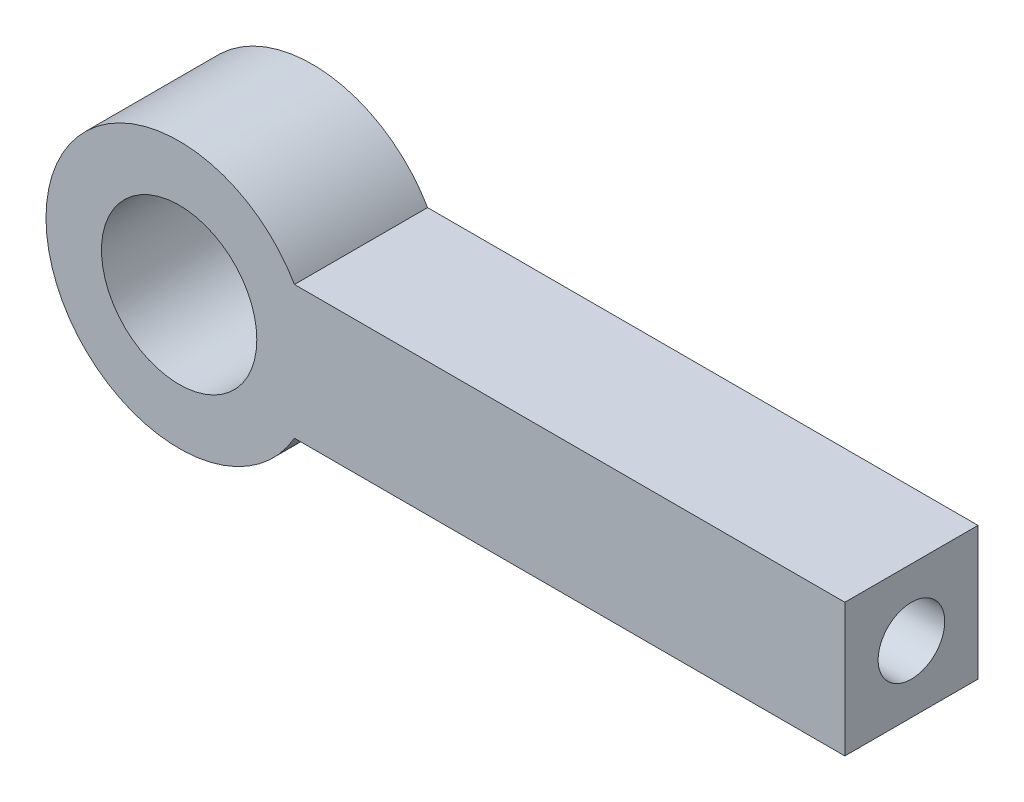
ISO-10303-21;
HEADER;
FILE_DESCRIPTION(('STEP AP214'),'2;1');
FILE_NAME('part.step','',(''),(''),'','','');
FILE_SCHEMA(('AUTOMOTIVE_DESIGN { 1 0 10303 214 1 1 1 1 }'));
ENDSEC;
DATA;
#1=APPLICATION_CONTEXT('core data for automotive mechanical design processes');
#2=APPLICATION_PROTOCOL_DEFINITION('international standard','automotive_design',2000,#1);
#3=PRODUCT_CONTEXT('',#1,'mechanical');
#4=PRODUCT('Part','Part','',(#3));
#5=PRODUCT_RELATED_PRODUCT_CATEGORY('part','',(#4));
#6=PRODUCT_DEFINITION_FORMATION('','',#4);
#7=PRODUCT_DEFINITION_CONTEXT('part definition',#1,'design');
#8=PRODUCT_DEFINITION('design','',#6,#7);
#9=PRODUCT_DEFINITION_SHAPE('','',#8);
#10=(LENGTH_UNIT() NAMED_UNIT(*) SI_UNIT(.MILLI.,.METRE.));
#11=(NAMED_UNIT(*) PLANE_ANGLE_UNIT() SI_UNIT($,.RADIAN.));
#12=(NAMED_UNIT(*) SI_UNIT($,.STERADIAN.) SOLID_ANGLE_UNIT());
#13=UNCERTAINTY_MEASURE_WITH_UNIT(LENGTH_MEASURE(1.E-05),#10,'distance_accuracy_value','');
#14=(GEOMETRIC_REPRESENTATION_CONTEXT(3) GLOBAL_UNCERTAINTY_ASSIGNED_CONTEXT((#13)) GLOBAL_UNIT_ASSIGNED_CONTEXT((#10,
#11,#12)) REPRESENTATION_CONTEXT('',''));
#15=CARTESIAN_POINT('',(0.,0.,0.));
#16=DIRECTION('',(0.,0.,1.));
#17=DIRECTION('',(1.,0.,0.));
#18=AXIS2_PLACEMENT_3D('',#15,#16,#17);
#19=CARTESIAN_POINT('',(0.,0.,3.));
#20=DIRECTION('',(0.,0.,-1.));
#21=DIRECTION('',(-1.,0.,0.));
#22=AXIS2_PLACEMENT_3D('',#19,#20,#21);
#23=CYLINDRICAL_SURFACE('',#22,6.);
#24=CARTESIAN_POINT('',(0.,0.,-3.));
#25=DIRECTION('',(0.,0.,1.));
#26=DIRECTION('',(1.,0.,0.));
#27=AXIS2_PLACEMENT_3D('',#24,#25,#26);
#28=CIRCLE('',#27,6.);
#29=CARTESIAN_POINT('',(5.19615242270663,3.,-3.));
#30=VERTEX_POINT('',#29);
#31=CARTESIAN_POINT('',(5.19615242270663,-3.,-3.));
#32=VERTEX_POINT('',#31);
#33=EDGE_CURVE('E96',#30,#32,#28,.T.);
#34=ORIENTED_EDGE('',*,*,#33,.T.);
#35=DIRECTION('',(0.,0.,-1.));
#36=VECTOR('',#35,1.);
#37=CARTESIAN_POINT('',(5.19615242270663,-3.,3.));
#38=LINE('',#37,#36);
#39=CARTESIAN_POINT('',(5.19615242270663,-3.,3.));
#40=VERTEX_POINT('',#39);
#41=EDGE_CURVE('E11',#40,#32,#38,.T.);
#42=ORIENTED_EDGE('',*,*,#41,.F.);
#43=CARTESIAN_POINT('',(0.,0.,3.));
#44=DIRECTION('',(0.,0.,1.));
#45=DIRECTION('',(1.,0.,0.));
#46=AXIS2_PLACEMENT_3D('',#43,#44,#45);
#47=CIRCLE('',#46,6.);
#48=CARTESIAN_POINT('',(5.19615242270663,3.,3.));
#49=VERTEX_POINT('',#48);
#50=EDGE_CURVE('E84',#49,#40,#47,.T.);
#51=ORIENTED_EDGE('',*,*,#50,.F.);
#52=DIRECTION('',(0.,0.,-1.));
#53=VECTOR('',#52,1.);
#54=CARTESIAN_POINT('',(5.19615242270663,3.,3.));
#55=LINE('',#54,#53);
#56=EDGE_CURVE('E92',#49,#30,#55,.T.);
#57=ORIENTED_EDGE('',*,*,#56,.T.);
#58=EDGE_LOOP('',(#34,#42,#51,#57));
#59=FACE_BOUND('',#58,.T.);
#60=ADVANCED_FACE('F33',(#59),#23,.T.);
#61=CARTESIAN_POINT('',(5.19615242270663,-3.,3.));
#62=DIRECTION('',(0.,1.,0.));
#63=DIRECTION('',(0.,0.,1.));
#64=AXIS2_PLACEMENT_3D('',#61,#62,#63);
#65=PLANE('',#64);
#66=DIRECTION('',(1.,0.,0.));
#67=VECTOR('',#66,1.);
#68=CARTESIAN_POINT('',(5.19615242270663,-3.,-3.));
#69=LINE('',#68,#67);
#70=CARTESIAN_POINT('',(30.,-3.,-3.));
#71=VERTEX_POINT('',#70);
#72=EDGE_CURVE('E88',#32,#71,#69,.T.);
#73=ORIENTED_EDGE('',*,*,#72,.T.);
#74=DIRECTION('',(0.,0.,-1.));
#75=VECTOR('',#74,1.);
#76=CARTESIAN_POINT('',(30.,-3.,3.));
#77=LINE('',#76,#75);
#78=CARTESIAN_POINT('',(30.,-3.,3.));
#79=VERTEX_POINT('',#78);
#80=EDGE_CURVE('E41',#79,#71,#77,.T.);
#81=ORIENTED_EDGE('',*,*,#80,.F.);
#82=DIRECTION('',(1.,0.,0.));
#83=VECTOR('',#82,1.);
#84=CARTESIAN_POINT('',(5.19615242270663,-3.,3.));
#85=LINE('',#84,#83);
#86=EDGE_CURVE('E79',#40,#79,#85,.T.);
#87=ORIENTED_EDGE('',*,*,#86,.F.);
#88=ORIENTED_EDGE('',*,*,#41,.T.);
#89=EDGE_LOOP('',(#73,#81,#87,#88));
#90=FACE_BOUND('',#89,.T.);
#91=ADVANCED_FACE('F87',(#90),#65,.F.);
#92=CARTESIAN_POINT('',(30.,-3.,3.));
#93=DIRECTION('',(-1.,0.,0.));
#94=DIRECTION('',(0.,0.,1.));
#95=AXIS2_PLACEMENT_3D('',#92,#93,#94);
#96=PLANE('',#95);
#97=CARTESIAN_POINT('',(30.,0.,0.));
#98=DIRECTION('',(1.,0.,0.));
#99=DIRECTION('',(0.,0.,-1.));
#100=AXIS2_PLACEMENT_3D('',#97,#98,#99);
#101=CIRCLE('',#100,1.5);
#102=CARTESIAN_POINT('',(30.,0.,-1.5));
#103=VERTEX_POINT('',#102);
#104=EDGE_CURVE('E116',#103,#103,#101,.T.);
#105=ORIENTED_EDGE('',*,*,#104,.F.);
#106=EDGE_LOOP('',(#105));
#107=FACE_BOUND('',#106,.T.);
#108=DIRECTION('',(0.,1.,0.));
#109=VECTOR('',#108,1.);
#110=CARTESIAN_POINT('',(30.,-3.,-3.));
#111=LINE('',#110,#109);
#112=CARTESIAN_POINT('',(30.,3.,-3.));
#113=VERTEX_POINT('',#112);
#114=EDGE_CURVE('E66',#71,#113,#111,.T.);
#115=ORIENTED_EDGE('',*,*,#114,.T.);
#116=DIRECTION('',(0.,0.,-1.));
#117=VECTOR('',#116,1.);
#118=CARTESIAN_POINT('',(30.,3.,3.));
#119=LINE('',#118,#117);
#120=CARTESIAN_POINT('',(30.,3.,3.));
#121=VERTEX_POINT('',#120);
#122=EDGE_CURVE('E89',#121,#113,#119,.T.);
#123=ORIENTED_EDGE('',*,*,#122,.F.);
#124=DIRECTION('',(0.,1.,0.));
#125=VECTOR('',#124,1.);
#126=CARTESIAN_POINT('',(30.,-3.,3.));
#127=LINE('',#126,#125);
#128=EDGE_CURVE('E82',#79,#121,#127,.T.);
#129=ORIENTED_EDGE('',*,*,#128,.F.);
#130=ORIENTED_EDGE('',*,*,#80,.T.);
#131=EDGE_LOOP('',(#115,#123,#129,#130));
#132=FACE_BOUND('',#131,.T.);
#133=ADVANCED_FACE('F90',(#107,#132),#96,.F.);
#134=CARTESIAN_POINT('',(5.19615242270663,3.,3.));
#135=DIRECTION('',(0.,-1.,0.));
#136=DIRECTION('',(0.,0.,-1.));
#137=AXIS2_PLACEMENT_3D('',#134,#135,#136);
#138=PLANE('',#137);
#139=DIRECTION('',(-1.,0.,0.));
#140=VECTOR('',#139,1.);
#141=CARTESIAN_POINT('',(5.19615242270663,3.,-3.));
#142=LINE('',#141,#140);
#143=EDGE_CURVE('E72',#113,#30,#142,.T.);
#144=ORIENTED_EDGE('',*,*,#143,.T.);
#145=ORIENTED_EDGE('',*,*,#56,.F.);
#146=DIRECTION('',(-1.,0.,0.));
#147=VECTOR('',#146,1.);
#148=CARTESIAN_POINT('',(5.19615242270663,3.,3.));
#149=LINE('',#148,#147);
#150=EDGE_CURVE('E49',#121,#49,#149,.T.);
#151=ORIENTED_EDGE('',*,*,#150,.F.);
#152=ORIENTED_EDGE('',*,*,#122,.T.);
#153=EDGE_LOOP('',(#144,#145,#151,#152));
#154=FACE_BOUND('',#153,.T.);
#155=ADVANCED_FACE('F104',(#154),#138,.F.);
#156=CARTESIAN_POINT('',(0.,0.,3.));
#157=DIRECTION('',(0.,0.,1.));
#158=DIRECTION('',(1.,0.,0.));
#159=AXIS2_PLACEMENT_3D('',#156,#157,#158);
#160=PLANE('',#159);
#161=CARTESIAN_POINT('',(0.,0.,3.));
#162=DIRECTION('',(0.,0.,1.));
#163=DIRECTION('',(1.,0.,0.));
#164=AXIS2_PLACEMENT_3D('',#161,#162,#163);
#165=CIRCLE('',#164,3.5);
#166=CARTESIAN_POINT('',(3.5,0.,3.));
#167=VERTEX_POINT('',#166);
#168=EDGE_CURVE('E99',#167,#167,#165,.T.);
#169=ORIENTED_EDGE('',*,*,#168,.F.);
#170=EDGE_LOOP('',(#169));
#171=FACE_BOUND('',#170,.T.);
#172=ORIENTED_EDGE('',*,*,#50,.T.);
#173=ORIENTED_EDGE('',*,*,#86,.T.);
#174=ORIENTED_EDGE('',*,*,#128,.T.);
#175=ORIENTED_EDGE('',*,*,#150,.T.);
#176=EDGE_LOOP('',(#172,#173,#174,#175));
#177=FACE_BOUND('',#176,.T.);
#178=ADVANCED_FACE('F80',(#171,#177),#160,.T.);
#179=CARTESIAN_POINT('',(0.,0.,-3.));
#180=DIRECTION('',(0.,0.,1.));
#181=DIRECTION('',(1.,0.,0.));
#182=AXIS2_PLACEMENT_3D('',#179,#180,#181);
#183=PLANE('',#182);
#184=CARTESIAN_POINT('',(0.,0.,-3.));
#185=DIRECTION('',(0.,0.,1.));
#186=DIRECTION('',(1.,0.,0.));
#187=AXIS2_PLACEMENT_3D('',#184,#185,#186);
#188=CIRCLE('',#187,3.5);
#189=CARTESIAN_POINT('',(3.5,0.,-3.));
#190=VERTEX_POINT('',#189);
#191=EDGE_CURVE('E112',#190,#190,#188,.T.);
#192=ORIENTED_EDGE('',*,*,#191,.T.);
#193=EDGE_LOOP('',(#192));
#194=FACE_BOUND('',#193,.T.);
#195=ORIENTED_EDGE('',*,*,#33,.F.);
#196=ORIENTED_EDGE('',*,*,#143,.F.);
#197=ORIENTED_EDGE('',*,*,#114,.F.);
#198=ORIENTED_EDGE('',*,*,#72,.F.);
#199=EDGE_LOOP('',(#195,#196,#197,#198));
#200=FACE_BOUND('',#199,.T.);
#201=ADVANCED_FACE('F107',(#194,#200),#183,.F.);
#202=CARTESIAN_POINT('',(0.,0.,-3.));
#203=DIRECTION('',(0.,0.,1.));
#204=DIRECTION('',(1.,0.,0.));
#205=AXIS2_PLACEMENT_3D('',#202,#203,#204);
#206=CYLINDRICAL_SURFACE('',#205,3.5);
#207=ORIENTED_EDGE('',*,*,#168,.T.);
#208=EDGE_LOOP('',(#207));
#209=FACE_BOUND('',#208,.T.);
#210=ORIENTED_EDGE('',*,*,#191,.F.);
#211=EDGE_LOOP('',(#210));
#212=FACE_BOUND('',#211,.T.);
#213=ADVANCED_FACE('F127',(#209,#212),#206,.F.);
#214=CARTESIAN_POINT('',(10.,0.,0.));
#215=DIRECTION('',(1.,0.,0.));
#216=DIRECTION('',(0.,0.,-1.));
#217=AXIS2_PLACEMENT_3D('',#214,#215,#216);
#218=CYLINDRICAL_SURFACE('',#217,1.5);
#219=CARTESIAN_POINT('',(10.,0.,0.));
#220=DIRECTION('',(1.,0.,0.));
#221=DIRECTION('',(0.,0.,-1.));
#222=AXIS2_PLACEMENT_3D('',#219,#220,#221);
#223=CIRCLE('',#222,1.5);
#224=CARTESIAN_POINT('',(10.,0.,-1.5));
#225=VERTEX_POINT('',#224);
#226=EDGE_CURVE('E115',#225,#225,#223,.T.);
#227=ORIENTED_EDGE('',*,*,#226,.F.);
#228=EDGE_LOOP('',(#227));
#229=FACE_BOUND('',#228,.T.);
#230=ORIENTED_EDGE('',*,*,#104,.T.);
#231=EDGE_LOOP('',(#230));
#232=FACE_BOUND('',#231,.T.);
#233=ADVANCED_FACE('F124',(#229,#232),#218,.F.);
#234=CARTESIAN_POINT('',(10.,0.,0.));
#235=DIRECTION('',(1.,0.,0.));
#236=DIRECTION('',(0.,0.,-1.));
#237=AXIS2_PLACEMENT_3D('',#234,#235,#236);
#238=PLANE('',#237);
#239=ORIENTED_EDGE('',*,*,#226,.T.);
#240=EDGE_LOOP('',(#239));
#241=FACE_BOUND('',#240,.T.);
#242=ADVANCED_FACE('F122',(#241),#238,.T.);
#243=CLOSED_SHELL('',(#60,#91,#133,#155,#178,#201,#213,#233,#242));
#244=MANIFOLD_SOLID_BREP('B2',#243);
#245=ADVANCED_BREP_SHAPE_REPRESENTATION('',(#18,#244),#14);
#246=SHAPE_DEFINITION_REPRESENTATION(#9,#245);
ENDSEC;
END-ISO-10303-21;
